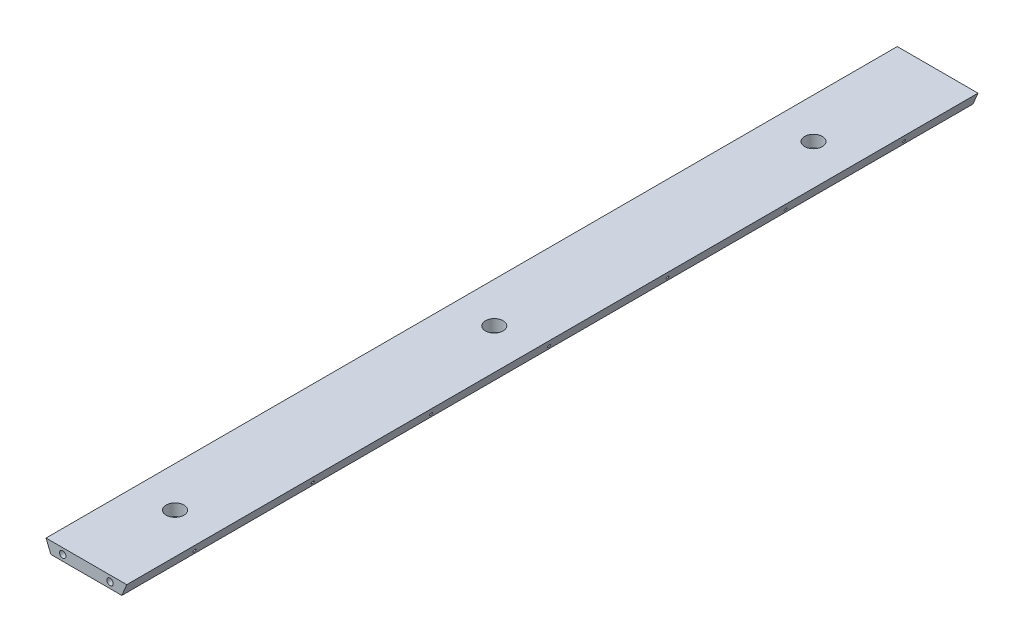
ISO-10303-21;
HEADER;
FILE_DESCRIPTION(('STEP AP214'),'2;1');
FILE_NAME('part.step','',(''),(''),'','','');
FILE_SCHEMA(('AUTOMOTIVE_DESIGN { 1 0 10303 214 1 1 1 1 }'));
ENDSEC;
DATA;
#1=APPLICATION_CONTEXT('core data for automotive mechanical design processes');
#2=APPLICATION_PROTOCOL_DEFINITION('international standard','automotive_design',2000,#1);
#3=PRODUCT_CONTEXT('',#1,'mechanical');
#4=PRODUCT('Part','Part','',(#3));
#5=PRODUCT_RELATED_PRODUCT_CATEGORY('part','',(#4));
#6=PRODUCT_DEFINITION_FORMATION('','',#4);
#7=PRODUCT_DEFINITION_CONTEXT('part definition',#1,'design');
#8=PRODUCT_DEFINITION('design','',#6,#7);
#9=PRODUCT_DEFINITION_SHAPE('','',#8);
#10=(LENGTH_UNIT() NAMED_UNIT(*) SI_UNIT(.MILLI.,.METRE.));
#11=(NAMED_UNIT(*) PLANE_ANGLE_UNIT() SI_UNIT($,.RADIAN.));
#12=(NAMED_UNIT(*) SI_UNIT($,.STERADIAN.) SOLID_ANGLE_UNIT());
#13=UNCERTAINTY_MEASURE_WITH_UNIT(LENGTH_MEASURE(1.E-05),#10,'distance_accuracy_value','');
#14=(GEOMETRIC_REPRESENTATION_CONTEXT(3) GLOBAL_UNCERTAINTY_ASSIGNED_CONTEXT((#13)) GLOBAL_UNIT_ASSIGNED_CONTEXT((#10,
#11,#12)) REPRESENTATION_CONTEXT('',''));
#15=CARTESIAN_POINT('',(0.,0.,0.));
#16=DIRECTION('',(0.,0.,1.));
#17=DIRECTION('',(1.,0.,0.));
#18=AXIS2_PLACEMENT_3D('',#15,#16,#17);
#19=CARTESIAN_POINT('',(19.05,45.9907683632075,457.2));
#20=DIRECTION('',(0.,1.,0.));
#21=DIRECTION('',(0.,0.,1.));
#22=AXIS2_PLACEMENT_3D('',#19,#20,#21);
#23=PLANE('',#22);
#24=CARTESIAN_POINT('',(0.,45.9907683632075,66.675));
#25=DIRECTION('',(0.,1.,0.));
#26=DIRECTION('',(-1.,0.,0.));
#27=AXIS2_PLACEMENT_3D('',#24,#25,#26);
#28=CIRCLE('',#27,4.76250000000001);
#29=CARTESIAN_POINT('',(-4.76250000000001,45.9907683632075,66.675));
#30=VERTEX_POINT('',#29);
#31=EDGE_CURVE('E180',#30,#30,#28,.T.);
#32=ORIENTED_EDGE('',*,*,#31,.T.);
#33=EDGE_LOOP('',(#32));
#34=FACE_BOUND('',#33,.T.);
#35=CARTESIAN_POINT('',(0.,45.9907683632075,238.125));
#36=DIRECTION('',(0.,1.,0.));
#37=DIRECTION('',(-1.,0.,0.));
#38=AXIS2_PLACEMENT_3D('',#35,#36,#37);
#39=CIRCLE('',#38,4.7625);
#40=CARTESIAN_POINT('',(-4.76249999999999,45.9907683632075,238.125));
#41=VERTEX_POINT('',#40);
#42=EDGE_CURVE('E184',#41,#41,#39,.T.);
#43=ORIENTED_EDGE('',*,*,#42,.T.);
#44=EDGE_LOOP('',(#43));
#45=FACE_BOUND('',#44,.T.);
#46=CARTESIAN_POINT('',(0.,45.9907683632075,409.575));
#47=DIRECTION('',(0.,1.,0.));
#48=DIRECTION('',(-1.,0.,0.));
#49=AXIS2_PLACEMENT_3D('',#46,#47,#48);
#50=CIRCLE('',#49,4.7625);
#51=CARTESIAN_POINT('',(-4.76249999999999,45.9907683632075,409.575));
#52=VERTEX_POINT('',#51);
#53=EDGE_CURVE('E187',#52,#52,#50,.T.);
#54=ORIENTED_EDGE('',*,*,#53,.T.);
#55=EDGE_LOOP('',(#54));
#56=FACE_BOUND('',#55,.T.);
#57=DIRECTION('',(1.,0.,0.));
#58=VECTOR('',#57,1.);
#59=CARTESIAN_POINT('',(19.05,45.9907683632075,0.));
#60=LINE('',#59,#58);
#61=CARTESIAN_POINT('',(-19.05,45.9907683632075,0.));
#62=VERTEX_POINT('',#61);
#63=CARTESIAN_POINT('',(19.05,45.9907683632075,0.));
#64=VERTEX_POINT('',#63);
#65=EDGE_CURVE('E130',#62,#64,#60,.T.);
#66=ORIENTED_EDGE('',*,*,#65,.T.);
#67=DIRECTION('',(0.,0.,-1.));
#68=VECTOR('',#67,1.);
#69=CARTESIAN_POINT('',(19.05,45.9907683632075,457.2));
#70=LINE('',#69,#68);
#71=CARTESIAN_POINT('',(19.05,45.9907683632075,457.2));
#72=VERTEX_POINT('',#71);
#73=EDGE_CURVE('E12',#72,#64,#70,.T.);
#74=ORIENTED_EDGE('',*,*,#73,.F.);
#75=DIRECTION('',(1.,0.,0.));
#76=VECTOR('',#75,1.);
#77=CARTESIAN_POINT('',(19.05,45.9907683632075,457.2));
#78=LINE('',#77,#76);
#79=CARTESIAN_POINT('',(-19.05,45.9907683632075,457.2));
#80=VERTEX_POINT('',#79);
#81=EDGE_CURVE('E131',#80,#72,#78,.T.);
#82=ORIENTED_EDGE('',*,*,#81,.F.);
#83=DIRECTION('',(0.,0.,-1.));
#84=VECTOR('',#83,1.);
#85=CARTESIAN_POINT('',(-19.05,45.9907683632075,457.2));
#86=LINE('',#85,#84);
#87=EDGE_CURVE('E137',#80,#62,#86,.T.);
#88=ORIENTED_EDGE('',*,*,#87,.T.);
#89=EDGE_LOOP('',(#66,#74,#82,#88));
#90=FACE_BOUND('',#89,.T.);
#91=ADVANCED_FACE('F35',(#34,#45,#56,#90),#23,.F.);
#92=CARTESIAN_POINT('',(21.6802561210692,52.3407683632075,457.2));
#93=DIRECTION('',(-0.923879532511287,0.38268343236509,0.));
#94=DIRECTION('',(-0.38268343236509,-0.923879532511287,0.));
#95=AXIS2_PLACEMENT_3D('',#92,#93,#94);
#96=PLANE('',#95);
#97=CARTESIAN_POINT('',(19.9612649233194,48.1907564999999,38.1));
#98=DIRECTION('',(0.923879532511287,-0.38268343236509,0.));
#99=DIRECTION('',(0.38268343236509,0.923879532511287,0.));
#100=AXIS2_PLACEMENT_3D('',#97,#98,#99);
#101=CIRCLE('',#100,0.793749999999904);
#102=CARTESIAN_POINT('',(20.2650198977592,48.9240858789307,38.1));
#103=VERTEX_POINT('',#102);
#104=EDGE_CURVE('E236',#103,#103,#101,.T.);
#105=ORIENTED_EDGE('',*,*,#104,.F.);
#106=EDGE_LOOP('',(#105));
#107=FACE_BOUND('',#106,.T.);
#108=CARTESIAN_POINT('',(19.9612649233194,48.1907564999999,101.6));
#109=DIRECTION('',(0.923879532511287,-0.38268343236509,0.));
#110=DIRECTION('',(0.38268343236509,0.923879532511287,0.));
#111=AXIS2_PLACEMENT_3D('',#108,#109,#110);
#112=CIRCLE('',#111,0.793749999999917);
#113=CARTESIAN_POINT('',(20.2650198977592,48.9240858789307,101.6));
#114=VERTEX_POINT('',#113);
#115=EDGE_CURVE('E242',#114,#114,#112,.T.);
#116=ORIENTED_EDGE('',*,*,#115,.F.);
#117=EDGE_LOOP('',(#116));
#118=FACE_BOUND('',#117,.T.);
#119=CARTESIAN_POINT('',(19.9612649233194,48.1907564999999,165.1));
#120=DIRECTION('',(0.923879532511287,-0.38268343236509,0.));
#121=DIRECTION('',(0.38268343236509,0.923879532511287,0.));
#122=AXIS2_PLACEMENT_3D('',#119,#120,#121);
#123=CIRCLE('',#122,0.793749999999904);
#124=CARTESIAN_POINT('',(20.2650198977591,48.9240858789307,165.1));
#125=VERTEX_POINT('',#124);
#126=EDGE_CURVE('E248',#125,#125,#123,.T.);
#127=ORIENTED_EDGE('',*,*,#126,.F.);
#128=EDGE_LOOP('',(#127));
#129=FACE_BOUND('',#128,.T.);
#130=CARTESIAN_POINT('',(19.9612649233194,48.1907564999999,228.6));
#131=DIRECTION('',(0.923879532511287,-0.38268343236509,0.));
#132=DIRECTION('',(0.38268343236509,0.923879532511287,0.));
#133=AXIS2_PLACEMENT_3D('',#130,#131,#132);
#134=CIRCLE('',#133,0.793749999999906);
#135=CARTESIAN_POINT('',(20.2650198977591,48.9240858789307,228.6));
#136=VERTEX_POINT('',#135);
#137=EDGE_CURVE('E254',#136,#136,#134,.T.);
#138=ORIENTED_EDGE('',*,*,#137,.F.);
#139=EDGE_LOOP('',(#138));
#140=FACE_BOUND('',#139,.T.);
#141=CARTESIAN_POINT('',(19.9612649233194,48.1907564999999,292.1));
#142=DIRECTION('',(0.923879532511287,-0.38268343236509,0.));
#143=DIRECTION('',(0.38268343236509,0.923879532511287,0.));
#144=AXIS2_PLACEMENT_3D('',#141,#142,#143);
#145=CIRCLE('',#144,0.793749999999908);
#146=CARTESIAN_POINT('',(20.2650198977591,48.9240858789307,292.1));
#147=VERTEX_POINT('',#146);
#148=EDGE_CURVE('E260',#147,#147,#145,.T.);
#149=ORIENTED_EDGE('',*,*,#148,.F.);
#150=EDGE_LOOP('',(#149));
#151=FACE_BOUND('',#150,.T.);
#152=CARTESIAN_POINT('',(19.9612649233194,48.1907564999999,355.6));
#153=DIRECTION('',(0.923879532511287,-0.38268343236509,0.));
#154=DIRECTION('',(0.38268343236509,0.923879532511287,0.));
#155=AXIS2_PLACEMENT_3D('',#152,#153,#154);
#156=CIRCLE('',#155,0.793749999999908);
#157=CARTESIAN_POINT('',(20.2650198977591,48.9240858789306,355.6));
#158=VERTEX_POINT('',#157);
#159=EDGE_CURVE('E266',#158,#158,#156,.T.);
#160=ORIENTED_EDGE('',*,*,#159,.F.);
#161=EDGE_LOOP('',(#160));
#162=FACE_BOUND('',#161,.T.);
#163=CARTESIAN_POINT('',(19.9612649233194,48.1907564999999,419.1));
#164=DIRECTION('',(0.923879532511287,-0.38268343236509,0.));
#165=DIRECTION('',(0.38268343236509,0.923879532511287,0.));
#166=AXIS2_PLACEMENT_3D('',#163,#164,#165);
#167=CIRCLE('',#166,0.793749999999906);
#168=CARTESIAN_POINT('',(20.2650198977591,48.9240858789306,419.1));
#169=VERTEX_POINT('',#168);
#170=EDGE_CURVE('E272',#169,#169,#167,.T.);
#171=ORIENTED_EDGE('',*,*,#170,.F.);
#172=EDGE_LOOP('',(#171));
#173=FACE_BOUND('',#172,.T.);
#174=DIRECTION('',(0.38268343236509,0.923879532511287,0.));
#175=VECTOR('',#174,1.);
#176=CARTESIAN_POINT('',(21.6802561210692,52.3407683632075,0.));
#177=LINE('',#176,#175);
#178=CARTESIAN_POINT('',(21.6802561210692,52.3407683632075,0.));
#179=VERTEX_POINT('',#178);
#180=EDGE_CURVE('E140',#64,#179,#177,.T.);
#181=ORIENTED_EDGE('',*,*,#180,.T.);
#182=DIRECTION('',(0.,0.,-1.));
#183=VECTOR('',#182,1.);
#184=CARTESIAN_POINT('',(21.6802561210692,52.3407683632075,457.2));
#185=LINE('',#184,#183);
#186=CARTESIAN_POINT('',(21.6802561210692,52.3407683632075,457.2));
#187=VERTEX_POINT('',#186);
#188=EDGE_CURVE('E43',#187,#179,#185,.T.);
#189=ORIENTED_EDGE('',*,*,#188,.F.);
#190=DIRECTION('',(0.38268343236509,0.923879532511287,0.));
#191=VECTOR('',#190,1.);
#192=CARTESIAN_POINT('',(21.6802561210692,52.3407683632075,457.2));
#193=LINE('',#192,#191);
#194=EDGE_CURVE('E82',#72,#187,#193,.T.);
#195=ORIENTED_EDGE('',*,*,#194,.F.);
#196=ORIENTED_EDGE('',*,*,#73,.T.);
#197=EDGE_LOOP('',(#181,#189,#195,#196));
#198=FACE_BOUND('',#197,.T.);
#199=ADVANCED_FACE('F165',(#107,#118,#129,#140,#151,#162,#173,#198),#96,.F.);
#200=CARTESIAN_POINT('',(-21.6802561210692,52.3407683632075,457.2));
#201=DIRECTION('',(0.,-1.,0.));
#202=DIRECTION('',(1.,0.,0.));
#203=AXIS2_PLACEMENT_3D('',#200,#201,#202);
#204=PLANE('',#203);
#205=CARTESIAN_POINT('',(0.,52.3407683632075,66.675));
#206=DIRECTION('',(0.,1.,0.));
#207=DIRECTION('',(-1.,0.,0.));
#208=AXIS2_PLACEMENT_3D('',#205,#206,#207);
#209=CIRCLE('',#208,4.76250000000001);
#210=CARTESIAN_POINT('',(-4.7625,52.3407683632075,66.675));
#211=VERTEX_POINT('',#210);
#212=EDGE_CURVE('E735',#211,#211,#209,.T.);
#213=ORIENTED_EDGE('',*,*,#212,.F.);
#214=EDGE_LOOP('',(#213));
#215=FACE_BOUND('',#214,.T.);
#216=CARTESIAN_POINT('',(0.,52.3407683632075,238.125));
#217=DIRECTION('',(0.,1.,0.));
#218=DIRECTION('',(-1.,0.,0.));
#219=AXIS2_PLACEMENT_3D('',#216,#217,#218);
#220=CIRCLE('',#219,4.7625);
#221=CARTESIAN_POINT('',(-4.76249999999999,52.3407683632075,238.125));
#222=VERTEX_POINT('',#221);
#223=EDGE_CURVE('E197',#222,#222,#220,.T.);
#224=ORIENTED_EDGE('',*,*,#223,.F.);
#225=EDGE_LOOP('',(#224));
#226=FACE_BOUND('',#225,.T.);
#227=CARTESIAN_POINT('',(0.,52.3407683632075,409.575));
#228=DIRECTION('',(0.,1.,0.));
#229=DIRECTION('',(-1.,0.,0.));
#230=AXIS2_PLACEMENT_3D('',#227,#228,#229);
#231=CIRCLE('',#230,4.7625);
#232=CARTESIAN_POINT('',(-4.76249999999999,52.3407683632075,409.575));
#233=VERTEX_POINT('',#232);
#234=EDGE_CURVE('E190',#233,#233,#231,.T.);
#235=ORIENTED_EDGE('',*,*,#234,.F.);
#236=EDGE_LOOP('',(#235));
#237=FACE_BOUND('',#236,.T.);
#238=DIRECTION('',(-1.,0.,0.));
#239=VECTOR('',#238,1.);
#240=CARTESIAN_POINT('',(-21.6802561210692,52.3407683632075,0.));
#241=LINE('',#240,#239);
#242=CARTESIAN_POINT('',(-21.6802561210692,52.3407683632075,0.));
#243=VERTEX_POINT('',#242);
#244=EDGE_CURVE('E69',#179,#243,#241,.T.);
#245=ORIENTED_EDGE('',*,*,#244,.T.);
#246=DIRECTION('',(0.,0.,-1.));
#247=VECTOR('',#246,1.);
#248=CARTESIAN_POINT('',(-21.6802561210692,52.3407683632075,457.2));
#249=LINE('',#248,#247);
#250=CARTESIAN_POINT('',(-21.6802561210692,52.3407683632075,457.2));
#251=VERTEX_POINT('',#250);
#252=EDGE_CURVE('E145',#251,#243,#249,.T.);
#253=ORIENTED_EDGE('',*,*,#252,.F.);
#254=DIRECTION('',(-1.,0.,0.));
#255=VECTOR('',#254,1.);
#256=CARTESIAN_POINT('',(-21.6802561210692,52.3407683632075,457.2));
#257=LINE('',#256,#255);
#258=EDGE_CURVE('E134',#187,#251,#257,.T.);
#259=ORIENTED_EDGE('',*,*,#258,.F.);
#260=ORIENTED_EDGE('',*,*,#188,.T.);
#261=EDGE_LOOP('',(#245,#253,#259,#260));
#262=FACE_BOUND('',#261,.T.);
#263=ADVANCED_FACE('F147',(#215,#226,#237,#262),#204,.F.);
#264=CARTESIAN_POINT('',(-19.05,45.9907683632075,457.2));
#265=DIRECTION('',(0.923879532511287,0.38268343236509,0.));
#266=DIRECTION('',(-0.38268343236509,0.923879532511287,0.));
#267=AXIS2_PLACEMENT_3D('',#264,#265,#266);
#268=PLANE('',#267);
#269=CARTESIAN_POINT('',(-19.9612649233194,48.1907564999999,38.1));
#270=DIRECTION('',(0.923879532511287,0.38268343236509,0.));
#271=DIRECTION('',(-0.38268343236509,0.923879532511287,0.));
#272=AXIS2_PLACEMENT_3D('',#269,#270,#271);
#273=CIRCLE('',#272,0.793749999999904);
#274=CARTESIAN_POINT('',(-20.2650198977592,48.9240858789307,38.1));
#275=VERTEX_POINT('',#274);
#276=EDGE_CURVE('E189',#275,#275,#273,.T.);
#277=ORIENTED_EDGE('',*,*,#276,.T.);
#278=EDGE_LOOP('',(#277));
#279=FACE_BOUND('',#278,.T.);
#280=CARTESIAN_POINT('',(-19.9612649233194,48.1907564999999,101.6));
#281=DIRECTION('',(0.923879532511287,0.38268343236509,0.));
#282=DIRECTION('',(-0.38268343236509,0.923879532511287,0.));
#283=AXIS2_PLACEMENT_3D('',#280,#281,#282);
#284=CIRCLE('',#283,0.793749999999917);
#285=CARTESIAN_POINT('',(-20.2650198977592,48.9240858789307,101.6));
#286=VERTEX_POINT('',#285);
#287=EDGE_CURVE('E201',#286,#286,#284,.T.);
#288=ORIENTED_EDGE('',*,*,#287,.T.);
#289=EDGE_LOOP('',(#288));
#290=FACE_BOUND('',#289,.T.);
#291=CARTESIAN_POINT('',(-19.9612649233194,48.1907564999999,165.1));
#292=DIRECTION('',(0.923879532511287,0.38268343236509,0.));
#293=DIRECTION('',(-0.38268343236509,0.923879532511287,0.));
#294=AXIS2_PLACEMENT_3D('',#291,#292,#293);
#295=CIRCLE('',#294,0.793749999999904);
#296=CARTESIAN_POINT('',(-20.2650198977591,48.9240858789307,165.1));
#297=VERTEX_POINT('',#296);
#298=EDGE_CURVE('E206',#297,#297,#295,.T.);
#299=ORIENTED_EDGE('',*,*,#298,.T.);
#300=EDGE_LOOP('',(#299));
#301=FACE_BOUND('',#300,.T.);
#302=CARTESIAN_POINT('',(-19.9612649233194,48.1907564999999,228.6));
#303=DIRECTION('',(0.923879532511287,0.38268343236509,0.));
#304=DIRECTION('',(-0.38268343236509,0.923879532511287,0.));
#305=AXIS2_PLACEMENT_3D('',#302,#303,#304);
#306=CIRCLE('',#305,0.793749999999906);
#307=CARTESIAN_POINT('',(-20.2650198977591,48.9240858789307,228.6));
#308=VERTEX_POINT('',#307);
#309=EDGE_CURVE('E212',#308,#308,#306,.T.);
#310=ORIENTED_EDGE('',*,*,#309,.T.);
#311=EDGE_LOOP('',(#310));
#312=FACE_BOUND('',#311,.T.);
#313=CARTESIAN_POINT('',(-19.9612649233194,48.1907564999999,292.1));
#314=DIRECTION('',(0.923879532511287,0.38268343236509,0.));
#315=DIRECTION('',(-0.38268343236509,0.923879532511287,0.));
#316=AXIS2_PLACEMENT_3D('',#313,#314,#315);
#317=CIRCLE('',#316,0.793749999999908);
#318=CARTESIAN_POINT('',(-20.2650198977591,48.9240858789307,292.1));
#319=VERTEX_POINT('',#318);
#320=EDGE_CURVE('E218',#319,#319,#317,.T.);
#321=ORIENTED_EDGE('',*,*,#320,.T.);
#322=EDGE_LOOP('',(#321));
#323=FACE_BOUND('',#322,.T.);
#324=CARTESIAN_POINT('',(-19.9612649233194,48.1907564999999,355.6));
#325=DIRECTION('',(0.923879532511287,0.38268343236509,0.));
#326=DIRECTION('',(-0.38268343236509,0.923879532511287,0.));
#327=AXIS2_PLACEMENT_3D('',#324,#325,#326);
#328=CIRCLE('',#327,0.793749999999908);
#329=CARTESIAN_POINT('',(-20.2650198977591,48.9240858789306,355.6));
#330=VERTEX_POINT('',#329);
#331=EDGE_CURVE('E224',#330,#330,#328,.T.);
#332=ORIENTED_EDGE('',*,*,#331,.T.);
#333=EDGE_LOOP('',(#332));
#334=FACE_BOUND('',#333,.T.);
#335=CARTESIAN_POINT('',(-19.9612649233194,48.1907564999999,419.1));
#336=DIRECTION('',(0.923879532511287,0.38268343236509,0.));
#337=DIRECTION('',(-0.38268343236509,0.923879532511287,0.));
#338=AXIS2_PLACEMENT_3D('',#335,#336,#337);
#339=CIRCLE('',#338,0.793749999999906);
#340=CARTESIAN_POINT('',(-20.2650198977591,48.9240858789306,419.1));
#341=VERTEX_POINT('',#340);
#342=EDGE_CURVE('E230',#341,#341,#339,.T.);
#343=ORIENTED_EDGE('',*,*,#342,.T.);
#344=EDGE_LOOP('',(#343));
#345=FACE_BOUND('',#344,.T.);
#346=DIRECTION('',(0.38268343236509,-0.923879532511287,0.));
#347=VECTOR('',#346,1.);
#348=CARTESIAN_POINT('',(-19.05,45.9907683632075,0.));
#349=LINE('',#348,#347);
#350=EDGE_CURVE('E75',#243,#62,#349,.T.);
#351=ORIENTED_EDGE('',*,*,#350,.T.);
#352=ORIENTED_EDGE('',*,*,#87,.F.);
#353=DIRECTION('',(0.38268343236509,-0.923879532511287,0.));
#354=VECTOR('',#353,1.);
#355=CARTESIAN_POINT('',(-19.05,45.9907683632075,457.2));
#356=LINE('',#355,#354);
#357=EDGE_CURVE('E51',#251,#80,#356,.T.);
#358=ORIENTED_EDGE('',*,*,#357,.F.);
#359=ORIENTED_EDGE('',*,*,#252,.T.);
#360=EDGE_LOOP('',(#351,#352,#358,#359));
#361=FACE_BOUND('',#360,.T.);
#362=ADVANCED_FACE('F154',(#279,#290,#301,#312,#323,#334,#345,#361),#268,.F.);
#363=CARTESIAN_POINT('',(0.,0.,457.2));
#364=DIRECTION('',(0.,0.,-1.));
#365=DIRECTION('',(-1.,0.,0.));
#366=AXIS2_PLACEMENT_3D('',#363,#364,#365);
#367=PLANE('',#366);
#368=CARTESIAN_POINT('',(-12.7,49.1657683632075,457.2));
#369=DIRECTION('',(0.,0.,1.));
#370=DIRECTION('',(1.,0.,0.));
#371=AXIS2_PLACEMENT_3D('',#368,#369,#370);
#372=CIRCLE('',#371,1.72719999999999);
#373=CARTESIAN_POINT('',(-10.9728,49.1657683632075,457.2));
#374=VERTEX_POINT('',#373);
#375=EDGE_CURVE('E106',#374,#374,#372,.T.);
#376=ORIENTED_EDGE('',*,*,#375,.F.);
#377=EDGE_LOOP('',(#376));
#378=FACE_BOUND('',#377,.T.);
#379=CARTESIAN_POINT('',(12.7,49.1657683632075,457.2));
#380=DIRECTION('',(0.,0.,1.));
#381=DIRECTION('',(1.,0.,0.));
#382=AXIS2_PLACEMENT_3D('',#379,#380,#381);
#383=CIRCLE('',#382,1.72719999999999);
#384=CARTESIAN_POINT('',(14.4272,49.1657683632075,457.2));
#385=VERTEX_POINT('',#384);
#386=EDGE_CURVE('E105',#385,#385,#383,.T.);
#387=ORIENTED_EDGE('',*,*,#386,.F.);
#388=EDGE_LOOP('',(#387));
#389=FACE_BOUND('',#388,.T.);
#390=ORIENTED_EDGE('',*,*,#81,.T.);
#391=ORIENTED_EDGE('',*,*,#194,.T.);
#392=ORIENTED_EDGE('',*,*,#258,.T.);
#393=ORIENTED_EDGE('',*,*,#357,.T.);
#394=EDGE_LOOP('',(#390,#391,#392,#393));
#395=FACE_BOUND('',#394,.T.);
#396=ADVANCED_FACE('F156',(#378,#389,#395),#367,.F.);
#397=CARTESIAN_POINT('',(0.,0.,0.));
#398=DIRECTION('',(0.,0.,-1.));
#399=DIRECTION('',(-1.,0.,0.));
#400=AXIS2_PLACEMENT_3D('',#397,#398,#399);
#401=PLANE('',#400);
#402=CARTESIAN_POINT('',(-12.7,49.1657683632075,0.));
#403=DIRECTION('',(0.,0.,-1.));
#404=DIRECTION('',(-1.,0.,0.));
#405=AXIS2_PLACEMENT_3D('',#402,#403,#404);
#406=CIRCLE('',#405,1.72719999999999);
#407=CARTESIAN_POINT('',(-14.4272,49.1657683632075,0.));
#408=VERTEX_POINT('',#407);
#409=EDGE_CURVE('E118',#408,#408,#406,.T.);
#410=ORIENTED_EDGE('',*,*,#409,.F.);
#411=EDGE_LOOP('',(#410));
#412=FACE_BOUND('',#411,.T.);
#413=CARTESIAN_POINT('',(12.7,49.1657683632075,0.));
#414=DIRECTION('',(0.,0.,-1.));
#415=DIRECTION('',(-1.,0.,0.));
#416=AXIS2_PLACEMENT_3D('',#413,#414,#415);
#417=CIRCLE('',#416,1.72719999999999);
#418=CARTESIAN_POINT('',(10.9728,49.1657683632075,0.));
#419=VERTEX_POINT('',#418);
#420=EDGE_CURVE('E124',#419,#419,#417,.T.);
#421=ORIENTED_EDGE('',*,*,#420,.F.);
#422=EDGE_LOOP('',(#421));
#423=FACE_BOUND('',#422,.T.);
#424=ORIENTED_EDGE('',*,*,#65,.F.);
#425=ORIENTED_EDGE('',*,*,#350,.F.);
#426=ORIENTED_EDGE('',*,*,#244,.F.);
#427=ORIENTED_EDGE('',*,*,#180,.F.);
#428=EDGE_LOOP('',(#424,#425,#426,#427));
#429=FACE_BOUND('',#428,.T.);
#430=ADVANCED_FACE('F150',(#412,#423,#429),#401,.T.);
#431=CARTESIAN_POINT('',(12.7,49.1657683632075,25.4));
#432=DIRECTION('',(0.,0.,-1.));
#433=DIRECTION('',(-1.,0.,0.));
#434=AXIS2_PLACEMENT_3D('',#431,#432,#433);
#435=CONICAL_SURFACE('',#434,1.7272,1.02974425867665);
#436=CARTESIAN_POINT('',(12.7,49.1657683632075,26.4378064611844));
#437=VERTEX_POINT('',#436);
#438=VERTEX_LOOP('',#437);
#439=FACE_BOUND('',#438,.T.);
#440=CARTESIAN_POINT('',(12.7,49.1657683632075,25.4));
#441=DIRECTION('',(0.,0.,-1.));
#442=DIRECTION('',(-1.,0.,0.));
#443=AXIS2_PLACEMENT_3D('',#440,#441,#442);
#444=CIRCLE('',#443,1.7272);
#445=CARTESIAN_POINT('',(10.9728,49.1657683632075,25.4));
#446=VERTEX_POINT('',#445);
#447=EDGE_CURVE('E127',#446,#446,#444,.T.);
#448=ORIENTED_EDGE('',*,*,#447,.T.);
#449=EDGE_LOOP('',(#448));
#450=FACE_BOUND('',#449,.T.);
#451=ADVANCED_FACE('F314',(#439,#450),#435,.F.);
#452=CARTESIAN_POINT('',(12.7,49.1657683632075,0.));
#453=DIRECTION('',(0.,0.,-1.));
#454=DIRECTION('',(-1.,0.,0.));
#455=AXIS2_PLACEMENT_3D('',#452,#453,#454);
#456=CYLINDRICAL_SURFACE('',#455,1.72719999999999);
#457=ORIENTED_EDGE('',*,*,#447,.F.);
#458=EDGE_LOOP('',(#457));
#459=FACE_BOUND('',#458,.T.);
#460=ORIENTED_EDGE('',*,*,#420,.T.);
#461=EDGE_LOOP('',(#460));
#462=FACE_BOUND('',#461,.T.);
#463=ADVANCED_FACE('F310',(#459,#462),#456,.F.);
#464=CARTESIAN_POINT('',(-12.7,49.1657683632075,25.4));
#465=DIRECTION('',(0.,0.,-1.));
#466=DIRECTION('',(-1.,0.,0.));
#467=AXIS2_PLACEMENT_3D('',#464,#465,#466);
#468=CONICAL_SURFACE('',#467,1.7272,1.02974425867665);
#469=CARTESIAN_POINT('',(-12.7,49.1657683632075,26.4378064611844));
#470=VERTEX_POINT('',#469);
#471=VERTEX_LOOP('',#470);
#472=FACE_BOUND('',#471,.T.);
#473=CARTESIAN_POINT('',(-12.7,49.1657683632075,25.4));
#474=DIRECTION('',(0.,0.,-1.));
#475=DIRECTION('',(-1.,0.,0.));
#476=AXIS2_PLACEMENT_3D('',#473,#474,#475);
#477=CIRCLE('',#476,1.7272);
#478=CARTESIAN_POINT('',(-14.4272,49.1657683632075,25.4));
#479=VERTEX_POINT('',#478);
#480=EDGE_CURVE('E121',#479,#479,#477,.T.);
#481=ORIENTED_EDGE('',*,*,#480,.T.);
#482=EDGE_LOOP('',(#481));
#483=FACE_BOUND('',#482,.T.);
#484=ADVANCED_FACE('F306',(#472,#483),#468,.F.);
#485=CARTESIAN_POINT('',(-12.7,49.1657683632075,0.));
#486=DIRECTION('',(0.,0.,-1.));
#487=DIRECTION('',(-1.,0.,0.));
#488=AXIS2_PLACEMENT_3D('',#485,#486,#487);
#489=CYLINDRICAL_SURFACE('',#488,1.72719999999999);
#490=ORIENTED_EDGE('',*,*,#480,.F.);
#491=EDGE_LOOP('',(#490));
#492=FACE_BOUND('',#491,.T.);
#493=ORIENTED_EDGE('',*,*,#409,.T.);
#494=EDGE_LOOP('',(#493));
#495=FACE_BOUND('',#494,.T.);
#496=ADVANCED_FACE('F302',(#492,#495),#489,.F.);
#497=CARTESIAN_POINT('',(12.7,49.1657683632075,431.8));
#498=DIRECTION('',(0.,0.,1.));
#499=DIRECTION('',(1.,0.,0.));
#500=AXIS2_PLACEMENT_3D('',#497,#498,#499);
#501=CONICAL_SURFACE('',#500,1.7272,1.02974425867665);
#502=CARTESIAN_POINT('',(12.7,49.1657683632075,430.762193538816));
#503=VERTEX_POINT('',#502);
#504=VERTEX_LOOP('',#503);
#505=FACE_BOUND('',#504,.T.);
#506=CARTESIAN_POINT('',(12.7,49.1657683632075,431.8));
#507=DIRECTION('',(0.,0.,1.));
#508=DIRECTION('',(1.,0.,0.));
#509=AXIS2_PLACEMENT_3D('',#506,#507,#508);
#510=CIRCLE('',#509,1.7272);
#511=CARTESIAN_POINT('',(14.4272,49.1657683632075,431.8));
#512=VERTEX_POINT('',#511);
#513=EDGE_CURVE('E109',#512,#512,#510,.T.);
#514=ORIENTED_EDGE('',*,*,#513,.T.);
#515=EDGE_LOOP('',(#514));
#516=FACE_BOUND('',#515,.T.);
#517=ADVANCED_FACE('F298',(#505,#516),#501,.F.);
#518=CARTESIAN_POINT('',(12.7,49.1657683632075,457.2));
#519=DIRECTION('',(0.,0.,1.));
#520=DIRECTION('',(1.,0.,0.));
#521=AXIS2_PLACEMENT_3D('',#518,#519,#520);
#522=CYLINDRICAL_SURFACE('',#521,1.72719999999999);
#523=ORIENTED_EDGE('',*,*,#513,.F.);
#524=EDGE_LOOP('',(#523));
#525=FACE_BOUND('',#524,.T.);
#526=ORIENTED_EDGE('',*,*,#386,.T.);
#527=EDGE_LOOP('',(#526));
#528=FACE_BOUND('',#527,.T.);
#529=ADVANCED_FACE('F99',(#525,#528),#522,.F.);
#530=CARTESIAN_POINT('',(-12.7,49.1657683632075,431.8));
#531=DIRECTION('',(0.,0.,1.));
#532=DIRECTION('',(1.,0.,0.));
#533=AXIS2_PLACEMENT_3D('',#530,#531,#532);
#534=CONICAL_SURFACE('',#533,1.7272,1.02974425867665);
#535=CARTESIAN_POINT('',(-12.7,49.1657683632075,430.762193538816));
#536=VERTEX_POINT('',#535);
#537=VERTEX_LOOP('',#536);
#538=FACE_BOUND('',#537,.T.);
#539=CARTESIAN_POINT('',(-12.7,49.1657683632075,431.8));
#540=DIRECTION('',(0.,0.,1.));
#541=DIRECTION('',(1.,0.,0.));
#542=AXIS2_PLACEMENT_3D('',#539,#540,#541);
#543=CIRCLE('',#542,1.7272);
#544=CARTESIAN_POINT('',(-10.9728,49.1657683632075,431.8));
#545=VERTEX_POINT('',#544);
#546=EDGE_CURVE('E103',#545,#545,#543,.T.);
#547=ORIENTED_EDGE('',*,*,#546,.T.);
#548=EDGE_LOOP('',(#547));
#549=FACE_BOUND('',#548,.T.);
#550=ADVANCED_FACE('F95',(#538,#549),#534,.F.);
#551=CARTESIAN_POINT('',(-12.7,49.1657683632075,457.2));
#552=DIRECTION('',(0.,0.,1.));
#553=DIRECTION('',(1.,0.,0.));
#554=AXIS2_PLACEMENT_3D('',#551,#552,#553);
#555=CYLINDRICAL_SURFACE('',#554,1.72719999999999);
#556=ORIENTED_EDGE('',*,*,#546,.F.);
#557=EDGE_LOOP('',(#556));
#558=FACE_BOUND('',#557,.T.);
#559=ORIENTED_EDGE('',*,*,#375,.T.);
#560=EDGE_LOOP('',(#559));
#561=FACE_BOUND('',#560,.T.);
#562=ADVANCED_FACE('F98',(#558,#561),#555,.F.);
#563=CARTESIAN_POINT('',(14.0946298918727,50.6207962955182,419.1));
#564=DIRECTION('',(0.923879532511287,-0.38268343236509,0.));
#565=DIRECTION('',(0.38268343236509,0.923879532511287,0.));
#566=AXIS2_PLACEMENT_3D('',#563,#564,#565);
#567=CYLINDRICAL_SURFACE('',#566,0.793749999999906);
#568=CARTESIAN_POINT('',(14.0946298918727,50.6207962955182,419.1));
#569=DIRECTION('',(0.923879532511287,-0.38268343236509,0.));
#570=DIRECTION('',(0.38268343236509,0.923879532511287,0.));
#571=AXIS2_PLACEMENT_3D('',#568,#569,#570);
#572=CIRCLE('',#571,0.793749999999906);
#573=CARTESIAN_POINT('',(14.3983848663124,51.354125674449,419.1));
#574=VERTEX_POINT('',#573);
#575=EDGE_CURVE('E112',#574,#574,#572,.T.);
#576=ORIENTED_EDGE('',*,*,#575,.F.);
#577=EDGE_LOOP('',(#576));
#578=FACE_BOUND('',#577,.T.);
#579=ORIENTED_EDGE('',*,*,#170,.T.);
#580=EDGE_LOOP('',(#579));
#581=FACE_BOUND('',#580,.T.);
#582=ADVANCED_FACE('F279',(#578,#581),#567,.F.);
#583=CARTESIAN_POINT('',(14.0946298918727,50.6207962955182,419.1));
#584=DIRECTION('',(0.923879532511287,-0.38268343236509,0.));
#585=DIRECTION('',(0.38268343236509,0.923879532511287,0.));
#586=AXIS2_PLACEMENT_3D('',#583,#584,#585);
#587=PLANE('',#586);
#588=ORIENTED_EDGE('',*,*,#575,.T.);
#589=EDGE_LOOP('',(#588));
#590=FACE_BOUND('',#589,.T.);
#591=ADVANCED_FACE('F282',(#590),#587,.T.);
#592=CARTESIAN_POINT('',(14.0946298918727,50.6207962955182,355.6));
#593=DIRECTION('',(0.923879532511287,-0.38268343236509,0.));
#594=DIRECTION('',(0.38268343236509,0.923879532511287,0.));
#595=AXIS2_PLACEMENT_3D('',#592,#593,#594);
#596=CYLINDRICAL_SURFACE('',#595,0.793749999999908);
#597=CARTESIAN_POINT('',(14.0946298918727,50.6207962955182,355.6));
#598=DIRECTION('',(0.923879532511287,-0.38268343236509,0.));
#599=DIRECTION('',(0.38268343236509,0.923879532511287,0.));
#600=AXIS2_PLACEMENT_3D('',#597,#598,#599);
#601=CIRCLE('',#600,0.793749999999908);
#602=CARTESIAN_POINT('',(14.3983848663124,51.354125674449,355.6));
#603=VERTEX_POINT('',#602);
#604=EDGE_CURVE('E269',#603,#603,#601,.T.);
#605=ORIENTED_EDGE('',*,*,#604,.F.);
#606=EDGE_LOOP('',(#605));
#607=FACE_BOUND('',#606,.T.);
#608=ORIENTED_EDGE('',*,*,#159,.T.);
#609=EDGE_LOOP('',(#608));
#610=FACE_BOUND('',#609,.T.);
#611=ADVANCED_FACE('F289',(#607,#610),#596,.F.);
#612=CARTESIAN_POINT('',(14.0946298918727,50.6207962955182,355.6));
#613=DIRECTION('',(0.923879532511287,-0.38268343236509,0.));
#614=DIRECTION('',(0.38268343236509,0.923879532511287,0.));
#615=AXIS2_PLACEMENT_3D('',#612,#613,#614);
#616=PLANE('',#615);
#617=ORIENTED_EDGE('',*,*,#604,.T.);
#618=EDGE_LOOP('',(#617));
#619=FACE_BOUND('',#618,.T.);
#620=ADVANCED_FACE('F389',(#619),#616,.T.);
#621=CARTESIAN_POINT('',(14.0946298918727,50.6207962955183,292.1));
#622=DIRECTION('',(0.923879532511287,-0.38268343236509,0.));
#623=DIRECTION('',(0.38268343236509,0.923879532511287,0.));
#624=AXIS2_PLACEMENT_3D('',#621,#622,#623);
#625=CYLINDRICAL_SURFACE('',#624,0.793749999999908);
#626=CARTESIAN_POINT('',(14.0946298918727,50.6207962955183,292.1));
#627=DIRECTION('',(0.923879532511287,-0.38268343236509,0.));
#628=DIRECTION('',(0.38268343236509,0.923879532511287,0.));
#629=AXIS2_PLACEMENT_3D('',#626,#627,#628);
#630=CIRCLE('',#629,0.793749999999908);
#631=CARTESIAN_POINT('',(14.3983848663124,51.354125674449,292.1));
#632=VERTEX_POINT('',#631);
#633=EDGE_CURVE('E263',#632,#632,#630,.T.);
#634=ORIENTED_EDGE('',*,*,#633,.F.);
#635=EDGE_LOOP('',(#634));
#636=FACE_BOUND('',#635,.T.);
#637=ORIENTED_EDGE('',*,*,#148,.T.);
#638=EDGE_LOOP('',(#637));
#639=FACE_BOUND('',#638,.T.);
#640=ADVANCED_FACE('F398',(#636,#639),#625,.F.);
#641=CARTESIAN_POINT('',(14.0946298918727,50.6207962955183,292.1));
#642=DIRECTION('',(0.923879532511287,-0.38268343236509,0.));
#643=DIRECTION('',(0.38268343236509,0.923879532511287,0.));
#644=AXIS2_PLACEMENT_3D('',#641,#642,#643);
#645=PLANE('',#644);
#646=ORIENTED_EDGE('',*,*,#633,.T.);
#647=EDGE_LOOP('',(#646));
#648=FACE_BOUND('',#647,.T.);
#649=ADVANCED_FACE('F408',(#648),#645,.T.);
#650=CARTESIAN_POINT('',(14.0946298918727,50.6207962955183,228.6));
#651=DIRECTION('',(0.923879532511287,-0.38268343236509,0.));
#652=DIRECTION('',(0.38268343236509,0.923879532511287,0.));
#653=AXIS2_PLACEMENT_3D('',#650,#651,#652);
#654=CYLINDRICAL_SURFACE('',#653,0.793749999999906);
#655=CARTESIAN_POINT('',(14.0946298918727,50.6207962955183,228.6));
#656=DIRECTION('',(0.923879532511287,-0.38268343236509,0.));
#657=DIRECTION('',(0.38268343236509,0.923879532511287,0.));
#658=AXIS2_PLACEMENT_3D('',#655,#656,#657);
#659=CIRCLE('',#658,0.793749999999906);
#660=CARTESIAN_POINT('',(14.3983848663124,51.354125674449,228.6));
#661=VERTEX_POINT('',#660);
#662=EDGE_CURVE('E257',#661,#661,#659,.T.);
#663=ORIENTED_EDGE('',*,*,#662,.F.);
#664=EDGE_LOOP('',(#663));
#665=FACE_BOUND('',#664,.T.);
#666=ORIENTED_EDGE('',*,*,#137,.T.);
#667=EDGE_LOOP('',(#666));
#668=FACE_BOUND('',#667,.T.);
#669=ADVANCED_FACE('F418',(#665,#668),#654,.F.);
#670=CARTESIAN_POINT('',(14.0946298918727,50.6207962955183,228.6));
#671=DIRECTION('',(0.923879532511287,-0.38268343236509,0.));
#672=DIRECTION('',(0.38268343236509,0.923879532511287,0.));
#673=AXIS2_PLACEMENT_3D('',#670,#671,#672);
#674=PLANE('',#673);
#675=ORIENTED_EDGE('',*,*,#662,.T.);
#676=EDGE_LOOP('',(#675));
#677=FACE_BOUND('',#676,.T.);
#678=ADVANCED_FACE('F428',(#677),#674,.T.);
#679=CARTESIAN_POINT('',(14.0946298918727,50.6207962955183,165.1));
#680=DIRECTION('',(0.923879532511287,-0.38268343236509,0.));
#681=DIRECTION('',(0.38268343236509,0.923879532511287,0.));
#682=AXIS2_PLACEMENT_3D('',#679,#680,#681);
#683=CYLINDRICAL_SURFACE('',#682,0.793749999999904);
#684=CARTESIAN_POINT('',(14.0946298918727,50.6207962955183,165.1));
#685=DIRECTION('',(0.923879532511287,-0.38268343236509,0.));
#686=DIRECTION('',(0.38268343236509,0.923879532511287,0.));
#687=AXIS2_PLACEMENT_3D('',#684,#685,#686);
#688=CIRCLE('',#687,0.793749999999904);
#689=CARTESIAN_POINT('',(14.3983848663124,51.354125674449,165.1));
#690=VERTEX_POINT('',#689);
#691=EDGE_CURVE('E251',#690,#690,#688,.T.);
#692=ORIENTED_EDGE('',*,*,#691,.F.);
#693=EDGE_LOOP('',(#692));
#694=FACE_BOUND('',#693,.T.);
#695=ORIENTED_EDGE('',*,*,#126,.T.);
#696=EDGE_LOOP('',(#695));
#697=FACE_BOUND('',#696,.T.);
#698=ADVANCED_FACE('F438',(#694,#697),#683,.F.);
#699=CARTESIAN_POINT('',(14.0946298918727,50.6207962955183,165.1));
#700=DIRECTION('',(0.923879532511287,-0.38268343236509,0.));
#701=DIRECTION('',(0.38268343236509,0.923879532511287,0.));
#702=AXIS2_PLACEMENT_3D('',#699,#700,#701);
#703=PLANE('',#702);
#704=ORIENTED_EDGE('',*,*,#691,.T.);
#705=EDGE_LOOP('',(#704));
#706=FACE_BOUND('',#705,.T.);
#707=ADVANCED_FACE('F448',(#706),#703,.T.);
#708=CARTESIAN_POINT('',(14.0946298918727,50.6207962955183,101.6));
#709=DIRECTION('',(0.923879532511287,-0.38268343236509,0.));
#710=DIRECTION('',(0.38268343236509,0.923879532511287,0.));
#711=AXIS2_PLACEMENT_3D('',#708,#709,#710);
#712=CYLINDRICAL_SURFACE('',#711,0.793749999999917);
#713=CARTESIAN_POINT('',(14.0946298918727,50.6207962955183,101.6));
#714=DIRECTION('',(0.923879532511287,-0.38268343236509,0.));
#715=DIRECTION('',(0.38268343236509,0.923879532511287,0.));
#716=AXIS2_PLACEMENT_3D('',#713,#714,#715);
#717=CIRCLE('',#716,0.793749999999917);
#718=CARTESIAN_POINT('',(14.3983848663124,51.354125674449,101.6));
#719=VERTEX_POINT('',#718);
#720=EDGE_CURVE('E245',#719,#719,#717,.T.);
#721=ORIENTED_EDGE('',*,*,#720,.F.);
#722=EDGE_LOOP('',(#721));
#723=FACE_BOUND('',#722,.T.);
#724=ORIENTED_EDGE('',*,*,#115,.T.);
#725=EDGE_LOOP('',(#724));
#726=FACE_BOUND('',#725,.T.);
#727=ADVANCED_FACE('F458',(#723,#726),#712,.F.);
#728=CARTESIAN_POINT('',(14.0946298918727,50.6207962955183,101.6));
#729=DIRECTION('',(0.923879532511287,-0.38268343236509,0.));
#730=DIRECTION('',(0.38268343236509,0.923879532511287,0.));
#731=AXIS2_PLACEMENT_3D('',#728,#729,#730);
#732=PLANE('',#731);
#733=ORIENTED_EDGE('',*,*,#720,.T.);
#734=EDGE_LOOP('',(#733));
#735=FACE_BOUND('',#734,.T.);
#736=ADVANCED_FACE('F468',(#735),#732,.T.);
#737=CARTESIAN_POINT('',(14.0946298918727,50.6207962955183,38.1));
#738=DIRECTION('',(0.923879532511287,-0.38268343236509,0.));
#739=DIRECTION('',(0.38268343236509,0.923879532511287,0.));
#740=AXIS2_PLACEMENT_3D('',#737,#738,#739);
#741=CYLINDRICAL_SURFACE('',#740,0.793749999999904);
#742=CARTESIAN_POINT('',(14.0946298918727,50.6207962955183,38.1));
#743=DIRECTION('',(0.923879532511287,-0.38268343236509,0.));
#744=DIRECTION('',(0.38268343236509,0.923879532511287,0.));
#745=AXIS2_PLACEMENT_3D('',#742,#743,#744);
#746=CIRCLE('',#745,0.793749999999904);
#747=CARTESIAN_POINT('',(14.3983848663124,51.354125674449,38.1));
#748=VERTEX_POINT('',#747);
#749=EDGE_CURVE('E239',#748,#748,#746,.T.);
#750=ORIENTED_EDGE('',*,*,#749,.F.);
#751=EDGE_LOOP('',(#750));
#752=FACE_BOUND('',#751,.T.);
#753=ORIENTED_EDGE('',*,*,#104,.T.);
#754=EDGE_LOOP('',(#753));
#755=FACE_BOUND('',#754,.T.);
#756=ADVANCED_FACE('F478',(#752,#755),#741,.F.);
#757=CARTESIAN_POINT('',(14.0946298918727,50.6207962955183,38.1));
#758=DIRECTION('',(0.923879532511287,-0.38268343236509,0.));
#759=DIRECTION('',(0.38268343236509,0.923879532511287,0.));
#760=AXIS2_PLACEMENT_3D('',#757,#758,#759);
#761=PLANE('',#760);
#762=ORIENTED_EDGE('',*,*,#749,.T.);
#763=EDGE_LOOP('',(#762));
#764=FACE_BOUND('',#763,.T.);
#765=ADVANCED_FACE('F488',(#764),#761,.T.);
#766=CARTESIAN_POINT('',(-14.0946298918727,50.6207962955182,419.1));
#767=DIRECTION('',(-0.923879532511287,-0.38268343236509,0.));
#768=DIRECTION('',(0.38268343236509,-0.923879532511287,0.));
#769=AXIS2_PLACEMENT_3D('',#766,#767,#768);
#770=CYLINDRICAL_SURFACE('',#769,0.793749999999906);
#771=CARTESIAN_POINT('',(-14.0946298918727,50.6207962955182,419.1));
#772=DIRECTION('',(0.923879532511287,0.38268343236509,0.));
#773=DIRECTION('',(-0.38268343236509,0.923879532511287,0.));
#774=AXIS2_PLACEMENT_3D('',#771,#772,#773);
#775=CIRCLE('',#774,0.793749999999906);
#776=CARTESIAN_POINT('',(-14.3983848663124,51.354125674449,419.1));
#777=VERTEX_POINT('',#776);
#778=EDGE_CURVE('E233',#777,#777,#775,.T.);
#779=ORIENTED_EDGE('',*,*,#778,.T.);
#780=EDGE_LOOP('',(#779));
#781=FACE_BOUND('',#780,.T.);
#782=ORIENTED_EDGE('',*,*,#342,.F.);
#783=EDGE_LOOP('',(#782));
#784=FACE_BOUND('',#783,.T.);
#785=ADVANCED_FACE('F498',(#781,#784),#770,.F.);
#786=CARTESIAN_POINT('',(-14.0946298918727,50.6207962955182,419.1));
#787=DIRECTION('',(-0.923879532511287,-0.38268343236509,0.));
#788=DIRECTION('',(-0.38268343236509,0.923879532511287,0.));
#789=AXIS2_PLACEMENT_3D('',#786,#787,#788);
#790=PLANE('',#789);
#791=ORIENTED_EDGE('',*,*,#778,.F.);
#792=EDGE_LOOP('',(#791));
#793=FACE_BOUND('',#792,.T.);
#794=ADVANCED_FACE('F508',(#793),#790,.T.);
#795=CARTESIAN_POINT('',(-14.0946298918727,50.6207962955182,355.6));
#796=DIRECTION('',(-0.923879532511287,-0.38268343236509,0.));
#797=DIRECTION('',(0.38268343236509,-0.923879532511287,0.));
#798=AXIS2_PLACEMENT_3D('',#795,#796,#797);
#799=CYLINDRICAL_SURFACE('',#798,0.793749999999908);
#800=CARTESIAN_POINT('',(-14.0946298918727,50.6207962955182,355.6));
#801=DIRECTION('',(0.923879532511287,0.38268343236509,0.));
#802=DIRECTION('',(-0.38268343236509,0.923879532511287,0.));
#803=AXIS2_PLACEMENT_3D('',#800,#801,#802);
#804=CIRCLE('',#803,0.793749999999908);
#805=CARTESIAN_POINT('',(-14.3983848663124,51.354125674449,355.6));
#806=VERTEX_POINT('',#805);
#807=EDGE_CURVE('E227',#806,#806,#804,.T.);
#808=ORIENTED_EDGE('',*,*,#807,.T.);
#809=EDGE_LOOP('',(#808));
#810=FACE_BOUND('',#809,.T.);
#811=ORIENTED_EDGE('',*,*,#331,.F.);
#812=EDGE_LOOP('',(#811));
#813=FACE_BOUND('',#812,.T.);
#814=ADVANCED_FACE('F518',(#810,#813),#799,.F.);
#815=CARTESIAN_POINT('',(-14.0946298918727,50.6207962955182,355.6));
#816=DIRECTION('',(-0.923879532511287,-0.38268343236509,0.));
#817=DIRECTION('',(-0.38268343236509,0.923879532511287,0.));
#818=AXIS2_PLACEMENT_3D('',#815,#816,#817);
#819=PLANE('',#818);
#820=ORIENTED_EDGE('',*,*,#807,.F.);
#821=EDGE_LOOP('',(#820));
#822=FACE_BOUND('',#821,.T.);
#823=ADVANCED_FACE('F528',(#822),#819,.T.);
#824=CARTESIAN_POINT('',(-14.0946298918727,50.6207962955183,292.1));
#825=DIRECTION('',(-0.923879532511287,-0.38268343236509,0.));
#826=DIRECTION('',(0.38268343236509,-0.923879532511287,0.));
#827=AXIS2_PLACEMENT_3D('',#824,#825,#826);
#828=CYLINDRICAL_SURFACE('',#827,0.793749999999908);
#829=CARTESIAN_POINT('',(-14.0946298918727,50.6207962955183,292.1));
#830=DIRECTION('',(0.923879532511287,0.38268343236509,0.));
#831=DIRECTION('',(-0.38268343236509,0.923879532511287,0.));
#832=AXIS2_PLACEMENT_3D('',#829,#830,#831);
#833=CIRCLE('',#832,0.793749999999908);
#834=CARTESIAN_POINT('',(-14.3983848663124,51.354125674449,292.1));
#835=VERTEX_POINT('',#834);
#836=EDGE_CURVE('E221',#835,#835,#833,.T.);
#837=ORIENTED_EDGE('',*,*,#836,.T.);
#838=EDGE_LOOP('',(#837));
#839=FACE_BOUND('',#838,.T.);
#840=ORIENTED_EDGE('',*,*,#320,.F.);
#841=EDGE_LOOP('',(#840));
#842=FACE_BOUND('',#841,.T.);
#843=ADVANCED_FACE('F538',(#839,#842),#828,.F.);
#844=CARTESIAN_POINT('',(-14.0946298918727,50.6207962955183,292.1));
#845=DIRECTION('',(-0.923879532511287,-0.38268343236509,0.));
#846=DIRECTION('',(-0.38268343236509,0.923879532511287,0.));
#847=AXIS2_PLACEMENT_3D('',#844,#845,#846);
#848=PLANE('',#847);
#849=ORIENTED_EDGE('',*,*,#836,.F.);
#850=EDGE_LOOP('',(#849));
#851=FACE_BOUND('',#850,.T.);
#852=ADVANCED_FACE('F548',(#851),#848,.T.);
#853=CARTESIAN_POINT('',(-14.0946298918727,50.6207962955183,228.6));
#854=DIRECTION('',(-0.923879532511287,-0.38268343236509,0.));
#855=DIRECTION('',(0.38268343236509,-0.923879532511287,0.));
#856=AXIS2_PLACEMENT_3D('',#853,#854,#855);
#857=CYLINDRICAL_SURFACE('',#856,0.793749999999906);
#858=CARTESIAN_POINT('',(-14.0946298918727,50.6207962955183,228.6));
#859=DIRECTION('',(0.923879532511287,0.38268343236509,0.));
#860=DIRECTION('',(-0.38268343236509,0.923879532511287,0.));
#861=AXIS2_PLACEMENT_3D('',#858,#859,#860);
#862=CIRCLE('',#861,0.793749999999906);
#863=CARTESIAN_POINT('',(-14.3983848663124,51.354125674449,228.6));
#864=VERTEX_POINT('',#863);
#865=EDGE_CURVE('E215',#864,#864,#862,.T.);
#866=ORIENTED_EDGE('',*,*,#865,.T.);
#867=EDGE_LOOP('',(#866));
#868=FACE_BOUND('',#867,.T.);
#869=ORIENTED_EDGE('',*,*,#309,.F.);
#870=EDGE_LOOP('',(#869));
#871=FACE_BOUND('',#870,.T.);
#872=ADVANCED_FACE('F558',(#868,#871),#857,.F.);
#873=CARTESIAN_POINT('',(-14.0946298918727,50.6207962955183,228.6));
#874=DIRECTION('',(-0.923879532511287,-0.38268343236509,0.));
#875=DIRECTION('',(-0.38268343236509,0.923879532511287,0.));
#876=AXIS2_PLACEMENT_3D('',#873,#874,#875);
#877=PLANE('',#876);
#878=ORIENTED_EDGE('',*,*,#865,.F.);
#879=EDGE_LOOP('',(#878));
#880=FACE_BOUND('',#879,.T.);
#881=ADVANCED_FACE('F568',(#880),#877,.T.);
#882=CARTESIAN_POINT('',(-14.0946298918727,50.6207962955183,165.1));
#883=DIRECTION('',(-0.923879532511287,-0.38268343236509,0.));
#884=DIRECTION('',(0.38268343236509,-0.923879532511287,0.));
#885=AXIS2_PLACEMENT_3D('',#882,#883,#884);
#886=CYLINDRICAL_SURFACE('',#885,0.793749999999904);
#887=CARTESIAN_POINT('',(-14.0946298918727,50.6207962955183,165.1));
#888=DIRECTION('',(0.923879532511287,0.38268343236509,0.));
#889=DIRECTION('',(-0.38268343236509,0.923879532511287,0.));
#890=AXIS2_PLACEMENT_3D('',#887,#888,#889);
#891=CIRCLE('',#890,0.793749999999904);
#892=CARTESIAN_POINT('',(-14.3983848663124,51.354125674449,165.1));
#893=VERTEX_POINT('',#892);
#894=EDGE_CURVE('E209',#893,#893,#891,.T.);
#895=ORIENTED_EDGE('',*,*,#894,.T.);
#896=EDGE_LOOP('',(#895));
#897=FACE_BOUND('',#896,.T.);
#898=ORIENTED_EDGE('',*,*,#298,.F.);
#899=EDGE_LOOP('',(#898));
#900=FACE_BOUND('',#899,.T.);
#901=ADVANCED_FACE('F578',(#897,#900),#886,.F.);
#902=CARTESIAN_POINT('',(-14.0946298918727,50.6207962955183,165.1));
#903=DIRECTION('',(-0.923879532511287,-0.38268343236509,0.));
#904=DIRECTION('',(-0.38268343236509,0.923879532511287,0.));
#905=AXIS2_PLACEMENT_3D('',#902,#903,#904);
#906=PLANE('',#905);
#907=ORIENTED_EDGE('',*,*,#894,.F.);
#908=EDGE_LOOP('',(#907));
#909=FACE_BOUND('',#908,.T.);
#910=ADVANCED_FACE('F588',(#909),#906,.T.);
#911=CARTESIAN_POINT('',(-14.0946298918727,50.6207962955183,101.6));
#912=DIRECTION('',(-0.923879532511287,-0.38268343236509,0.));
#913=DIRECTION('',(0.38268343236509,-0.923879532511287,0.));
#914=AXIS2_PLACEMENT_3D('',#911,#912,#913);
#915=CYLINDRICAL_SURFACE('',#914,0.793749999999917);
#916=CARTESIAN_POINT('',(-14.0946298918727,50.6207962955183,101.6));
#917=DIRECTION('',(0.923879532511287,0.38268343236509,0.));
#918=DIRECTION('',(-0.38268343236509,0.923879532511287,0.));
#919=AXIS2_PLACEMENT_3D('',#916,#917,#918);
#920=CIRCLE('',#919,0.793749999999917);
#921=CARTESIAN_POINT('',(-14.3983848663124,51.354125674449,101.6));
#922=VERTEX_POINT('',#921);
#923=EDGE_CURVE('E203',#922,#922,#920,.T.);
#924=ORIENTED_EDGE('',*,*,#923,.T.);
#925=EDGE_LOOP('',(#924));
#926=FACE_BOUND('',#925,.T.);
#927=ORIENTED_EDGE('',*,*,#287,.F.);
#928=EDGE_LOOP('',(#927));
#929=FACE_BOUND('',#928,.T.);
#930=ADVANCED_FACE('F598',(#926,#929),#915,.F.);
#931=CARTESIAN_POINT('',(-14.0946298918727,50.6207962955183,101.6));
#932=DIRECTION('',(-0.923879532511287,-0.38268343236509,0.));
#933=DIRECTION('',(-0.38268343236509,0.923879532511287,0.));
#934=AXIS2_PLACEMENT_3D('',#931,#932,#933);
#935=PLANE('',#934);
#936=ORIENTED_EDGE('',*,*,#923,.F.);
#937=EDGE_LOOP('',(#936));
#938=FACE_BOUND('',#937,.T.);
#939=ADVANCED_FACE('F608',(#938),#935,.T.);
#940=CARTESIAN_POINT('',(-14.0946298918727,50.6207962955183,38.1));
#941=DIRECTION('',(-0.923879532511287,-0.38268343236509,0.));
#942=DIRECTION('',(0.38268343236509,-0.923879532511287,0.));
#943=AXIS2_PLACEMENT_3D('',#940,#941,#942);
#944=CYLINDRICAL_SURFACE('',#943,0.793749999999904);
#945=CARTESIAN_POINT('',(-14.0946298918727,50.6207962955183,38.1));
#946=DIRECTION('',(0.923879532511287,0.38268343236509,0.));
#947=DIRECTION('',(-0.38268343236509,0.923879532511287,0.));
#948=AXIS2_PLACEMENT_3D('',#945,#946,#947);
#949=CIRCLE('',#948,0.793749999999904);
#950=CARTESIAN_POINT('',(-14.3983848663124,51.354125674449,38.1));
#951=VERTEX_POINT('',#950);
#952=EDGE_CURVE('E192',#951,#951,#949,.T.);
#953=ORIENTED_EDGE('',*,*,#952,.T.);
#954=EDGE_LOOP('',(#953));
#955=FACE_BOUND('',#954,.T.);
#956=ORIENTED_EDGE('',*,*,#276,.F.);
#957=EDGE_LOOP('',(#956));
#958=FACE_BOUND('',#957,.T.);
#959=ADVANCED_FACE('F618',(#955,#958),#944,.F.);
#960=CARTESIAN_POINT('',(-14.0946298918727,50.6207962955183,38.1));
#961=DIRECTION('',(-0.923879532511287,-0.38268343236509,0.));
#962=DIRECTION('',(-0.38268343236509,0.923879532511287,0.));
#963=AXIS2_PLACEMENT_3D('',#960,#961,#962);
#964=PLANE('',#963);
#965=ORIENTED_EDGE('',*,*,#952,.F.);
#966=EDGE_LOOP('',(#965));
#967=FACE_BOUND('',#966,.T.);
#968=ADVANCED_FACE('F628',(#967),#964,.T.);
#969=CARTESIAN_POINT('',(0.,45.9907683632075,409.575));
#970=DIRECTION('',(0.,1.,0.));
#971=DIRECTION('',(-1.,0.,0.));
#972=AXIS2_PLACEMENT_3D('',#969,#970,#971);
#973=CYLINDRICAL_SURFACE('',#972,4.7625);
#974=ORIENTED_EDGE('',*,*,#53,.F.);
#975=EDGE_LOOP('',(#974));
#976=FACE_BOUND('',#975,.T.);
#977=ORIENTED_EDGE('',*,*,#234,.T.);
#978=EDGE_LOOP('',(#977));
#979=FACE_BOUND('',#978,.T.);
#980=ADVANCED_FACE('F638',(#976,#979),#973,.F.);
#981=CARTESIAN_POINT('',(0.,45.9907683632075,238.125));
#982=DIRECTION('',(0.,1.,0.));
#983=DIRECTION('',(-1.,0.,0.));
#984=AXIS2_PLACEMENT_3D('',#981,#982,#983);
#985=CYLINDRICAL_SURFACE('',#984,4.7625);
#986=ORIENTED_EDGE('',*,*,#42,.F.);
#987=EDGE_LOOP('',(#986));
#988=FACE_BOUND('',#987,.T.);
#989=ORIENTED_EDGE('',*,*,#223,.T.);
#990=EDGE_LOOP('',(#989));
#991=FACE_BOUND('',#990,.T.);
#992=ADVANCED_FACE('F648',(#988,#991),#985,.F.);
#993=CARTESIAN_POINT('',(0.,45.9907683632075,66.675));
#994=DIRECTION('',(0.,1.,0.));
#995=DIRECTION('',(-1.,0.,0.));
#996=AXIS2_PLACEMENT_3D('',#993,#994,#995);
#997=CYLINDRICAL_SURFACE('',#996,4.76250000000001);
#998=ORIENTED_EDGE('',*,*,#31,.F.);
#999=EDGE_LOOP('',(#998));
#1000=FACE_BOUND('',#999,.T.);
#1001=ORIENTED_EDGE('',*,*,#212,.T.);
#1002=EDGE_LOOP('',(#1001));
#1003=FACE_BOUND('',#1002,.T.);
#1004=ADVANCED_FACE('F657',(#1000,#1003),#997,.F.);
#1005=CLOSED_SHELL('',(#91,#199,#263,#362,#396,#430,#451,#463,#484,#496,#517,#529,#550,#562,
#582,#591,#611,#620,#640,#649,#669,#678,#698,#707,#727,#736,#756,#765,#785,#794,#814,#823,#843,
#852,#872,#881,#901,#910,#930,#939,#959,#968,#980,#992,#1004));
#1006=MANIFOLD_SOLID_BREP('B2',#1005);
#1007=ADVANCED_BREP_SHAPE_REPRESENTATION('',(#18,#1006),#14);
#1008=SHAPE_DEFINITION_REPRESENTATION(#9,#1007);
ENDSEC;
END-ISO-10303-21;
